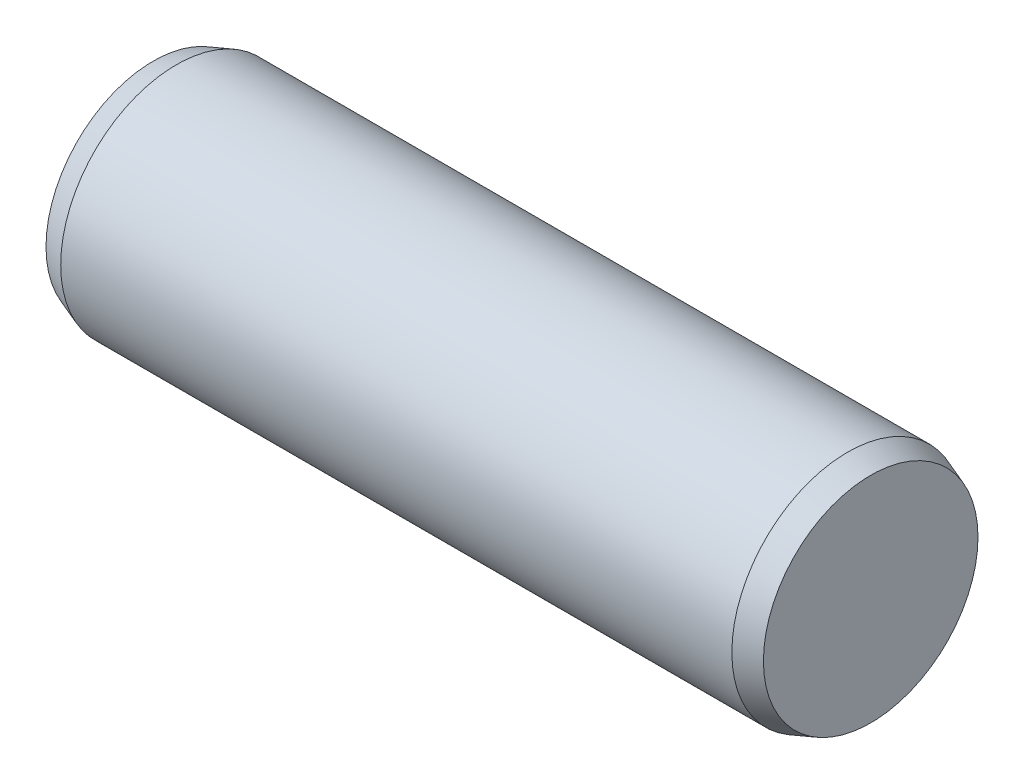
ISO-10303-21;
HEADER;
FILE_DESCRIPTION(('STEP AP214'),'2;1');
FILE_NAME('part.step','',(''),(''),'','','');
FILE_SCHEMA(('AUTOMOTIVE_DESIGN { 1 0 10303 214 1 1 1 1 }'));
ENDSEC;
DATA;
#1=APPLICATION_CONTEXT('core data for automotive mechanical design processes');
#2=APPLICATION_PROTOCOL_DEFINITION('international standard','automotive_design',2000,#1);
#3=PRODUCT_CONTEXT('',#1,'mechanical');
#4=PRODUCT('Part','Part','',(#3));
#5=PRODUCT_RELATED_PRODUCT_CATEGORY('part','',(#4));
#6=PRODUCT_DEFINITION_FORMATION('','',#4);
#7=PRODUCT_DEFINITION_CONTEXT('part definition',#1,'design');
#8=PRODUCT_DEFINITION('design','',#6,#7);
#9=PRODUCT_DEFINITION_SHAPE('','',#8);
#10=(LENGTH_UNIT() NAMED_UNIT(*) SI_UNIT(.MILLI.,.METRE.));
#11=(NAMED_UNIT(*) PLANE_ANGLE_UNIT() SI_UNIT($,.RADIAN.));
#12=(NAMED_UNIT(*) SI_UNIT($,.STERADIAN.) SOLID_ANGLE_UNIT());
#13=UNCERTAINTY_MEASURE_WITH_UNIT(LENGTH_MEASURE(1.E-05),#10,'distance_accuracy_value','');
#14=(GEOMETRIC_REPRESENTATION_CONTEXT(3) GLOBAL_UNCERTAINTY_ASSIGNED_CONTEXT((#13)) GLOBAL_UNIT_ASSIGNED_CONTEXT((#10,
#11,#12)) REPRESENTATION_CONTEXT('',''));
#15=CARTESIAN_POINT('',(0.,0.,0.));
#16=DIRECTION('',(0.,0.,1.));
#17=DIRECTION('',(1.,0.,0.));
#18=AXIS2_PLACEMENT_3D('',#15,#16,#17);
#19=CARTESIAN_POINT('',(0.,0.,0.));
#20=DIRECTION('',(-1.,0.,0.));
#21=DIRECTION('',(0.,0.,1.));
#22=AXIS2_PLACEMENT_3D('',#19,#20,#21);
#23=PLANE('',#22);
#24=CARTESIAN_POINT('',(-5.6843418860808E-11,0.,0.));
#25=DIRECTION('',(-1.,0.,0.));
#26=DIRECTION('',(0.,0.,1.));
#27=AXIS2_PLACEMENT_3D('',#24,#25,#26);
#28=CIRCLE('',#27,2.31801488291443);
#29=CARTESIAN_POINT('',(-5.6843418860808E-11,0.,2.31801488291443));
#30=VERTEX_POINT('',#29);
#31=EDGE_CURVE('E18',#30,#30,#28,.T.);
#32=ORIENTED_EDGE('',*,*,#31,.F.);
#33=EDGE_LOOP('',(#32));
#34=FACE_BOUND('',#33,.T.);
#35=ADVANCED_FACE('F15',(#34),#23,.F.);
#36=CARTESIAN_POINT('',(-15.5,0.,0.));
#37=DIRECTION('',(-1.,0.,0.));
#38=DIRECTION('',(0.,0.,1.));
#39=AXIS2_PLACEMENT_3D('',#36,#37,#38);
#40=PLANE('',#39);
#41=CARTESIAN_POINT('',(-15.4999999999745,0.,0.));
#42=DIRECTION('',(1.,0.,0.));
#43=DIRECTION('',(0.,0.,-1.));
#44=AXIS2_PLACEMENT_3D('',#41,#42,#43);
#45=CIRCLE('',#44,2.31801488287305);
#46=CARTESIAN_POINT('',(-15.4999999999745,0.,-2.31801488287305));
#47=VERTEX_POINT('',#46);
#48=EDGE_CURVE('E27',#47,#47,#45,.T.);
#49=ORIENTED_EDGE('',*,*,#48,.F.);
#50=EDGE_LOOP('',(#49));
#51=FACE_BOUND('',#50,.T.);
#52=ADVANCED_FACE('F38',(#51),#40,.T.);
#53=CARTESIAN_POINT('',(-0.499999999760803,0.,0.));
#54=DIRECTION('',(-1.,0.,0.));
#55=DIRECTION('',(0.,0.,1.));
#56=AXIS2_PLACEMENT_3D('',#53,#54,#55);
#57=CONICAL_SURFACE('',#56,2.4999999999693,0.349065850451);
#58=CARTESIAN_POINT('',(-0.5,0.,0.));
#59=DIRECTION('',(-1.,0.,0.));
#60=DIRECTION('',(0.,0.,1.));
#61=AXIS2_PLACEMENT_3D('',#58,#59,#60);
#62=CIRCLE('',#61,2.5);
#63=CARTESIAN_POINT('',(-0.5,0.,2.5));
#64=VERTEX_POINT('',#63);
#65=EDGE_CURVE('E22',#64,#64,#62,.T.);
#66=ORIENTED_EDGE('',*,*,#65,.F.);
#67=EDGE_LOOP('',(#66));
#68=FACE_BOUND('',#67,.T.);
#69=ORIENTED_EDGE('',*,*,#31,.T.);
#70=EDGE_LOOP('',(#69));
#71=FACE_BOUND('',#70,.T.);
#72=ADVANCED_FACE('F35',(#68,#71),#57,.T.);
#73=CARTESIAN_POINT('',(-15.0000000002706,0.,0.));
#74=DIRECTION('',(1.,0.,0.));
#75=DIRECTION('',(0.,0.,-1.));
#76=AXIS2_PLACEMENT_3D('',#73,#74,#75);
#77=CONICAL_SURFACE('',#76,2.49999999988404,0.349065850373494);
#78=CARTESIAN_POINT('',(-15.,0.,0.));
#79=DIRECTION('',(-1.,0.,0.));
#80=DIRECTION('',(0.,0.,1.));
#81=AXIS2_PLACEMENT_3D('',#78,#79,#80);
#82=CIRCLE('',#81,2.5);
#83=CARTESIAN_POINT('',(-15.,0.,2.5));
#84=VERTEX_POINT('',#83);
#85=EDGE_CURVE('E10',#84,#84,#82,.F.);
#86=ORIENTED_EDGE('',*,*,#85,.F.);
#87=EDGE_LOOP('',(#86));
#88=FACE_BOUND('',#87,.T.);
#89=ORIENTED_EDGE('',*,*,#48,.T.);
#90=EDGE_LOOP('',(#89));
#91=FACE_BOUND('',#90,.T.);
#92=ADVANCED_FACE('F46',(#88,#91),#77,.T.);
#93=CARTESIAN_POINT('',(0.775,0.,0.));
#94=DIRECTION('',(-1.,0.,0.));
#95=DIRECTION('',(0.,0.,1.));
#96=AXIS2_PLACEMENT_3D('',#93,#94,#95);
#97=CYLINDRICAL_SURFACE('',#96,2.5);
#98=ORIENTED_EDGE('',*,*,#85,.T.);
#99=EDGE_LOOP('',(#98));
#100=FACE_BOUND('',#99,.T.);
#101=ORIENTED_EDGE('',*,*,#65,.T.);
#102=EDGE_LOOP('',(#101));
#103=FACE_BOUND('',#102,.T.);
#104=ADVANCED_FACE('F44',(#100,#103),#97,.T.);
#105=CLOSED_SHELL('',(#35,#52,#72,#92,#104));
#106=MANIFOLD_SOLID_BREP('B1',#105);
#107=ADVANCED_BREP_SHAPE_REPRESENTATION('',(#18,#106),#14);
#108=SHAPE_DEFINITION_REPRESENTATION(#9,#107);
ENDSEC;
END-ISO-10303-21;
